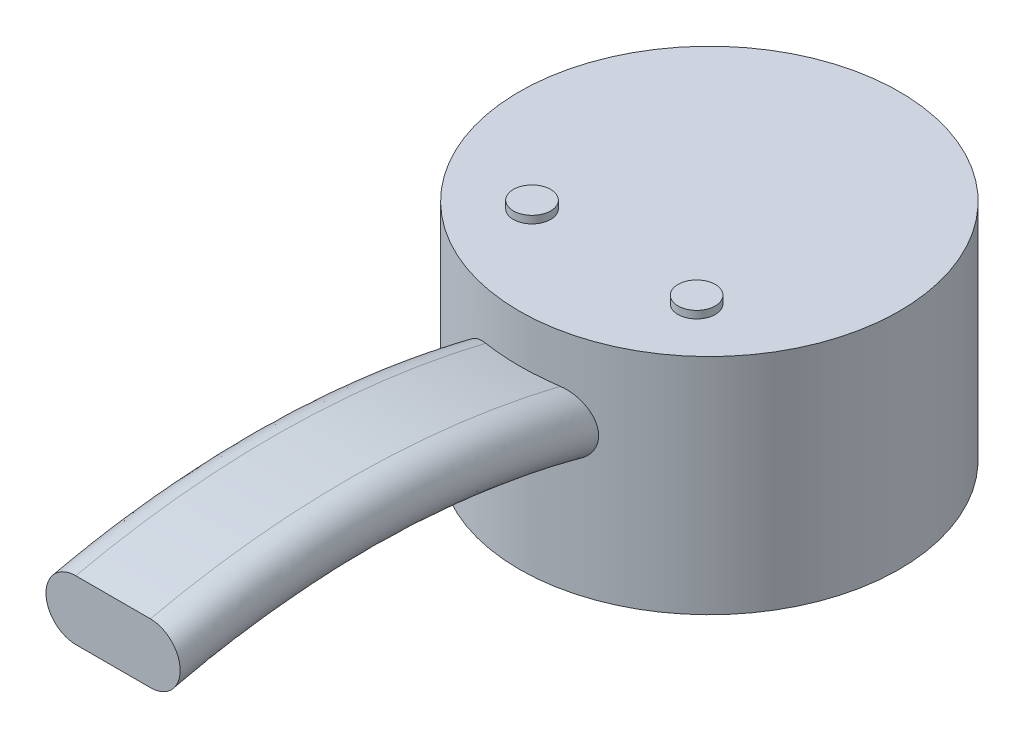
ISO-10303-21;
HEADER;
FILE_DESCRIPTION(('STEP AP214'),'2;1');
FILE_NAME('part.step','',(''),(''),'','','');
FILE_SCHEMA(('AUTOMOTIVE_DESIGN { 1 0 10303 214 1 1 1 1 }'));
ENDSEC;
DATA;
#1=APPLICATION_CONTEXT('core data for automotive mechanical design processes');
#2=APPLICATION_PROTOCOL_DEFINITION('international standard','automotive_design',2000,#1);
#3=PRODUCT_CONTEXT('',#1,'mechanical');
#4=PRODUCT('Part','Part','',(#3));
#5=PRODUCT_RELATED_PRODUCT_CATEGORY('part','',(#4));
#6=PRODUCT_DEFINITION_FORMATION('','',#4);
#7=PRODUCT_DEFINITION_CONTEXT('part definition',#1,'design');
#8=PRODUCT_DEFINITION('design','',#6,#7);
#9=PRODUCT_DEFINITION_SHAPE('','',#8);
#10=(LENGTH_UNIT() NAMED_UNIT(*) SI_UNIT(.MILLI.,.METRE.));
#11=(NAMED_UNIT(*) PLANE_ANGLE_UNIT() SI_UNIT($,.RADIAN.));
#12=(NAMED_UNIT(*) SI_UNIT($,.STERADIAN.) SOLID_ANGLE_UNIT());
#13=UNCERTAINTY_MEASURE_WITH_UNIT(LENGTH_MEASURE(1.E-05),#10,'distance_accuracy_value','');
#14=(GEOMETRIC_REPRESENTATION_CONTEXT(3) GLOBAL_UNCERTAINTY_ASSIGNED_CONTEXT((#13)) GLOBAL_UNIT_ASSIGNED_CONTEXT((#10,
#11,#12)) REPRESENTATION_CONTEXT('',''));
#15=CARTESIAN_POINT('',(0.,0.,0.));
#16=DIRECTION('',(0.,0.,1.));
#17=DIRECTION('',(1.,0.,0.));
#18=AXIS2_PLACEMENT_3D('',#15,#16,#17);
#19=CARTESIAN_POINT('',(0.,30.,0.));
#20=DIRECTION('',(0.,-1.,0.));
#21=DIRECTION('',(0.,0.,-1.));
#22=AXIS2_PLACEMENT_3D('',#19,#20,#21);
#23=CYLINDRICAL_SURFACE('',#22,25.5);
#24=CARTESIAN_POINT('',(5.00000000000001,23.5171234591143,25.0049995001));
#25=CARTESIAN_POINT('',(5.11586119327294,23.5114770083202,24.9818400676881));
#26=CARTESIAN_POINT('',(5.2312836132771,23.5005587174941,24.9579147875684));
#27=CARTESIAN_POINT('',(5.46037433476177,23.4685496245778,24.9087920461385));
#28=CARTESIAN_POINT('',(5.57404352125647,23.4474641405948,24.8835952560734));
#29=CARTESIAN_POINT('',(5.79846972880424,23.3955786294533,24.8322567669333));
#30=CARTESIAN_POINT('',(5.90923575231437,23.3648138093524,24.8061187916789));
#31=CARTESIAN_POINT('',(6.12755297742745,23.2939969636314,24.7530954583561));
#32=CARTESIAN_POINT('',(6.23510380190959,23.253943853346,24.726210013323));
#33=CARTESIAN_POINT('',(6.55155375823598,23.1206894196052,24.6449658670733));
#34=CARTESIAN_POINT('',(6.75485452415625,23.0142502326013,24.5898797439162));
#35=CARTESIAN_POINT('',(7.14184282455997,22.7699829208294,24.4802924908404));
#36=CARTESIAN_POINT('',(7.32551072220129,22.6321237934209,24.4257919947653));
#37=CARTESIAN_POINT('',(7.68124026389445,22.3185948201263,24.3163619404927));
#38=CARTESIAN_POINT('',(7.85167928023143,22.1409996230069,24.2616521894264));
#39=CARTESIAN_POINT('',(8.1619769913878,21.7591169834799,24.1590336054701));
#40=CARTESIAN_POINT('',(8.30182786784529,21.5548227380334,24.1111265124421));
#41=CARTESIAN_POINT('',(8.55029490673224,21.118209986877,24.0241617462246));
#42=CARTESIAN_POINT('',(8.65793723646408,20.885271394577,23.9853863515872));
#43=CARTESIAN_POINT('',(8.78825520716183,20.5235258147427,23.9378083382814));
#44=CARTESIAN_POINT('',(8.82651461052759,20.4008250963177,23.9237089092328));
#45=CARTESIAN_POINT('',(8.89208287767288,20.1521769487625,23.8994162818095));
#46=CARTESIAN_POINT('',(8.91939793592266,20.0262313992857,23.8892208739143));
#47=CARTESIAN_POINT('',(8.96109477502268,19.7805002960236,23.8736096869514));
#48=CARTESIAN_POINT('',(8.97621034380283,19.6608558781217,23.8679231669153));
#49=CARTESIAN_POINT('',(8.99598498935999,19.4206344787343,23.8604771300486));
#50=CARTESIAN_POINT('',(9.00064968806253,19.3000580336702,23.8587155018703));
#51=CARTESIAN_POINT('',(8.99920510913911,19.0590345770044,23.859260432564));
#52=CARTESIAN_POINT('',(8.99310143647839,18.9385875306998,23.8615648750358));
#53=CARTESIAN_POINT('',(8.96991488800981,18.6989056631677,23.870290782688));
#54=CARTESIAN_POINT('',(8.95283329588516,18.579670701863,23.8767117665079));
#55=CARTESIAN_POINT('',(8.91014469835881,18.356736220759,23.8926720043126));
#56=CARTESIAN_POINT('',(8.88569622225414,18.2527829131021,23.9017853732483));
#57=CARTESIAN_POINT('',(8.82813385508486,18.04757553106,23.92310588636));
#58=CARTESIAN_POINT('',(8.79501638596408,17.9463225902879,23.9353143079281));
#59=CARTESIAN_POINT('',(8.72031459655158,17.7474301337763,23.9626311654879));
#60=CARTESIAN_POINT('',(8.67873279585804,17.6497895529344,23.9777387384057));
#61=CARTESIAN_POINT('',(8.58741137172211,17.458924278827,24.010595943986));
#62=CARTESIAN_POINT('',(8.53767577756446,17.3656974336452,24.0283442712929));
#63=CARTESIAN_POINT('',(8.43359433063942,17.1896849881222,24.0650648665652));
#64=CARTESIAN_POINT('',(8.37969322539625,17.1066078564257,24.0839032627538));
#65=CARTESIAN_POINT('',(8.26541913683764,16.9455122435495,24.1233600328423));
#66=CARTESIAN_POINT('',(8.20504764119031,16.8674926061461,24.1439779973737));
#67=CARTESIAN_POINT('',(8.07828800064618,16.7169756771163,24.1866849442757));
#68=CARTESIAN_POINT('',(8.01190167444683,16.6444767283276,24.2087734814588));
#69=CARTESIAN_POINT('',(7.87355747290219,16.5053247833144,24.2541214764869));
#70=CARTESIAN_POINT('',(7.80159538783623,16.438676286793,24.2773818143189));
#71=CARTESIAN_POINT('',(7.5747276033712,16.2451563136957,24.3495168067577));
#72=CARTESIAN_POINT('',(7.41170935037708,16.1281091791383,24.3997646686806));
#73=CARTESIAN_POINT('',(7.06909306986959,15.9220479800501,24.50122061115));
#74=CARTESIAN_POINT('',(6.88948762486398,15.8330465363035,24.5524291130409));
#75=CARTESIAN_POINT('',(6.60489749786124,15.7188472655062,24.6299808651231));
#76=CARTESIAN_POINT('',(6.50409365413252,15.6832341996257,24.6568029861296));
#77=CARTESIAN_POINT('',(6.29980900509476,15.6204044659123,24.709785682138));
#78=CARTESIAN_POINT('',(6.19633050918533,15.5931808006264,24.735946791665));
#79=CARTESIAN_POINT('',(5.98736088284321,15.5471642925692,24.7873574605625));
#80=CARTESIAN_POINT('',(5.8818707634541,15.5283673252017,24.8126074603145));
#81=CARTESIAN_POINT('',(5.66948869749156,15.4991996570407,24.8619946478658));
#82=CARTESIAN_POINT('',(5.56259701230969,15.4888274071291,24.8861320394786));
#83=CARTESIAN_POINT('',(5.37960255934615,15.4783047294108,24.9262088836014));
#84=CARTESIAN_POINT('',(5.30368476183768,15.4760459275743,24.9424726351605));
#85=CARTESIAN_POINT('',(5.15183471420414,15.4757048592893,24.9742791867459));
#86=CARTESIAN_POINT('',(5.07590274803902,15.4776149108436,24.9898232590248));
#87=CARTESIAN_POINT('',(5.,15.4815974424021,25.0049995001));
#88=B_SPLINE_CURVE_WITH_KNOTS('',3,(#24,#25,#26,#27,#28,#29,#30,#31,#32,#33,#34,#35,#36,#37,#38,
#39,#40,#41,#42,#43,#44,#45,#46,#47,#48,#49,#50,#51,#52,#53,#54,#55,#56,#57,#58,#59,#60,#61,#62,
#63,#64,#65,#66,#67,#68,#69,#70,#71,#72,#73,#74,#75,#76,#77,#78,#79,#80,#81,#82,#83,#84,#85,#86,
#87),.UNSPECIFIED.,.F.,.F.,(4,2,2,2,2,2,2,2,2,2,2,2,2,2,2,2,2,2,2,2,2,2,2,2,2,2,2,2,2,2,2,4),
(0.,0.3547019810116,0.709218630607935,1.0624604060178,1.41574345298626,2.12042372064439,
2.82580234306327,3.57883990833118,4.33206972646943,5.10618960831037,5.49362596057393,
5.88084271406502,6.24253735873861,6.60403738716725,6.96534930940218,7.32661898996438,
7.64773653263051,7.96898682350076,8.29014162648954,8.61113820311302,8.91320784878158,
9.21520819117619,9.51711752089114,9.81925705712564,10.4370388899571,11.0550983338245,
11.3854640923617,11.7155535480599,12.0454812587592,12.3753482893526,12.608258880812,
12.8407406474764),.UNSPECIFIED.);
#89=CARTESIAN_POINT('',(5.,23.5171234591143,25.0049995001));
#90=VERTEX_POINT('',#89);
#91=CARTESIAN_POINT('',(5.,15.4815974424021,25.0049995001));
#92=VERTEX_POINT('',#91);
#93=EDGE_CURVE('E263',#90,#92,#88,.T.);
#94=ORIENTED_EDGE('',*,*,#93,.T.);
#95=CARTESIAN_POINT('',(5.,15.4815974424021,25.0049995001));
#96=CARTESIAN_POINT('',(4.6571869189848,15.4995803882547,25.0735484072848));
#97=CARTESIAN_POINT('',(4.31291148382205,15.5156515066156,25.1350565929772));
#98=CARTESIAN_POINT('',(3.62196680378393,15.54400818985,25.2438845090512));
#99=CARTESIAN_POINT('',(3.27529753374851,15.5562937148736,25.2912040900728));
#100=CARTESIAN_POINT('',(2.23225789405615,15.5875359844931,25.4117461583066));
#101=CARTESIAN_POINT('',(1.53310136537391,15.6008656297786,25.4635028415472));
#102=CARTESIAN_POINT('',(0.144696030938419,15.6125591726033,25.5088928790099));
#103=CARTESIAN_POINT('',(-0.54452142306145,15.6111712356133,25.5034900511607));
#104=CARTESIAN_POINT('',(-1.91972717469327,15.5940153593431,25.4369406445132));
#105=CARTESIAN_POINT('',(-2.6057173939908,15.5782574802201,25.3758330636962));
#106=CARTESIAN_POINT('',(-3.57416839090423,15.5455709217045,25.2499286163593));
#107=CARTESIAN_POINT('',(-3.85994467978717,15.5346204942045,25.207821366889));
#108=CARTESIAN_POINT('',(-4.43081799155923,15.5100900437521,25.1137769292275));
#109=CARTESIAN_POINT('',(-4.71590888814118,15.4965007173594,25.0618049780939));
#110=CARTESIAN_POINT('',(-4.99999999999999,15.4815974424021,25.0049995001));
#111=B_SPLINE_CURVE_WITH_KNOTS('',3,(#95,#96,#97,#98,#99,#100,#101,#102,#103,#104,#105,#106,
#107,#108,#109,#110),.UNSPECIFIED.,.F.,.F.,(4,2,2,2,2,2,2,4),(0.,1.0500161844102,
2.10004342170411,4.20084803283539,6.2662863279001,8.33027975315213,9.19734407080484,
10.0675226186394),.UNSPECIFIED.);
#112=CARTESIAN_POINT('',(-4.99999999999999,15.4815974424021,25.0049995001));
#113=VERTEX_POINT('',#112);
#114=EDGE_CURVE('E276',#92,#113,#111,.T.);
#115=ORIENTED_EDGE('',*,*,#114,.T.);
#116=CARTESIAN_POINT('',(-5.,15.4815974424021,25.0049995001));
#117=CARTESIAN_POINT('',(-5.11482978239013,15.4755667568966,24.9820460784526));
#118=CARTESIAN_POINT('',(-5.22974246747253,15.4742888865266,24.95823787164));
#119=CARTESIAN_POINT('',(-5.45896900362491,15.4812732708612,24.9091006081208));
#120=CARTESIAN_POINT('',(-5.57328275911831,15.489537004264,24.8837713162627));
#121=CARTESIAN_POINT('',(-5.80074285198038,15.5156676495377,24.8317347313428));
#122=CARTESIAN_POINT('',(-5.91388632685383,15.5335541481524,24.8050247284866));
#123=CARTESIAN_POINT('',(-6.13796363412349,15.5789289908289,24.7505290724648));
#124=CARTESIAN_POINT('',(-6.24889758841804,15.6064168036306,24.7227434788894));
#125=CARTESIAN_POINT('',(-6.46792789544616,15.6709936484387,24.666347924498));
#126=CARTESIAN_POINT('',(-6.57601945691516,15.7080978739871,24.6377367234077));
#127=CARTESIAN_POINT('',(-6.78834959386935,15.7917808891694,24.5800815934871));
#128=CARTESIAN_POINT('',(-6.89258837752725,15.8383591660159,24.551037688156));
#129=CARTESIAN_POINT('',(-7.09631441948191,15.9407929065271,24.4929282866582));
#130=CARTESIAN_POINT('',(-7.19580467457471,15.996642416714,24.4638628161871));
#131=CARTESIAN_POINT('',(-7.3892042016699,16.1173648578013,24.4061434870948));
#132=CARTESIAN_POINT('',(-7.48311661062217,16.1822326469599,24.377489404121));
#133=CARTESIAN_POINT('',(-7.66061063154283,16.317655247193,24.3222800211074));
#134=CARTESIAN_POINT('',(-7.74446419697446,16.387838504285,24.2956876945929));
#135=CARTESIAN_POINT('',(-7.90558253430665,16.5357514562494,24.2437399628309));
#136=CARTESIAN_POINT('',(-7.98285022271389,16.6134777777758,24.2183840122147));
#137=CARTESIAN_POINT('',(-8.13013462374817,16.7760074525565,24.1693388039873));
#138=CARTESIAN_POINT('',(-8.20015145466266,16.8608106903201,24.1456495191886));
#139=CARTESIAN_POINT('',(-8.33228212470535,17.0368877234655,24.1003724924203));
#140=CARTESIAN_POINT('',(-8.39439649479268,17.1281610834834,24.0787846092822));
#141=CARTESIAN_POINT('',(-8.50593526163346,17.309603250999,24.0395986359107));
#142=CARTESIAN_POINT('',(-8.5559541455297,17.3993692254603,24.0218245351527));
#143=CARTESIAN_POINT('',(-8.6483417418668,17.5832281620523,23.9887180885508));
#144=CARTESIAN_POINT('',(-8.69070790011536,17.6773225557482,23.973386558146));
#145=CARTESIAN_POINT('',(-8.76744755410127,17.869027924518,23.945428203225));
#146=CARTESIAN_POINT('',(-8.801826416409,17.9666364872398,23.9327995631207));
#147=CARTESIAN_POINT('',(-8.86244539302846,18.1647076652455,23.9104183621629));
#148=CARTESIAN_POINT('',(-8.88868250028627,18.2651713201031,23.9006668640106));
#149=CARTESIAN_POINT('',(-8.93213282106418,18.4645894244979,23.8844620120042));
#150=CARTESIAN_POINT('',(-8.94962961795667,18.5634737146311,23.8779052096075));
#151=CARTESIAN_POINT('',(-8.97695486046135,18.7624535612758,23.8676450430625));
#152=CARTESIAN_POINT('',(-8.98678061451421,18.8625495304339,23.8639426804647));
#153=CARTESIAN_POINT('',(-9.00483072308566,19.1635665478612,23.8571435724773));
#154=CARTESIAN_POINT('',(-9.00166395467309,19.3653850096357,23.8583412267305));
#155=CARTESIAN_POINT('',(-8.96553519456566,19.7743424059596,23.8719400607578));
#156=CARTESIAN_POINT('',(-8.93132876989897,19.9813493358601,23.8848091569794));
#157=CARTESIAN_POINT('',(-8.83371143238156,20.3873960133887,23.9210832265717));
#158=CARTESIAN_POINT('',(-8.77028948512826,20.5864327198456,23.944492180663));
#159=CARTESIAN_POINT('',(-8.60919466927908,20.9916421413623,24.0029122558939));
#160=CARTESIAN_POINT('',(-8.50876165042433,21.1965840379453,24.0388396396859));
#161=CARTESIAN_POINT('',(-8.27901585834714,21.5878345545886,24.1189274003429));
#162=CARTESIAN_POINT('',(-8.14969069989044,21.7741351339119,24.1630913066243));
#163=CARTESIAN_POINT('',(-7.8519671421234,22.1407569571345,24.261562971034));
#164=CARTESIAN_POINT('',(-7.68104148520145,22.318878054285,24.3164336549171));
#165=CARTESIAN_POINT('',(-7.31222878653569,22.6437214766366,24.4298671932071));
#166=CARTESIAN_POINT('',(-7.11432345678298,22.7904223288855,24.4884325374252));
#167=CARTESIAN_POINT('',(-6.79847441442305,22.9846142924268,24.577289810063));
#168=CARTESIAN_POINT('',(-6.68859363114987,23.0456015968664,24.6074438585203));
#169=CARTESIAN_POINT('',(-6.46371181727921,23.1573903406761,24.6674672161777));
#170=CARTESIAN_POINT('',(-6.34871307748689,23.2081962823024,24.6973366456477));
#171=CARTESIAN_POINT('',(-6.11457340980803,23.298915169836,24.7563436012019));
#172=CARTESIAN_POINT('',(-5.99544040062084,23.3388477703468,24.7854823602734));
#173=CARTESIAN_POINT('',(-5.75375813258521,23.4073331692949,24.8426984833486));
#174=CARTESIAN_POINT('',(-5.6312110796103,23.4358931413369,24.8707765062909));
#175=CARTESIAN_POINT('',(-5.42372651601799,23.4738065355774,24.9166720486733));
#176=CARTESIAN_POINT('',(-5.33945022976337,23.4863844650782,24.9348698272169));
#177=CARTESIAN_POINT('',(-5.17019503345469,23.5059597360663,24.97051421492));
#178=CARTESIAN_POINT('',(-5.08521701213188,23.5129632875845,24.9879616394334));
#179=CARTESIAN_POINT('',(-5.,23.5171234591143,25.0049995001));
#180=B_SPLINE_CURVE_WITH_KNOTS('',3,(#116,#117,#118,#119,#120,#121,#122,#123,#124,#125,#126,
#127,#128,#129,#130,#131,#132,#133,#134,#135,#136,#137,#138,#139,#140,#141,#142,#143,#144,#145,
#146,#147,#148,#149,#150,#151,#152,#153,#154,#155,#156,#157,#158,#159,#160,#161,#162,#163,#164,
#165,#166,#167,#168,#169,#170,#171,#172,#173,#174,#175,#176,#177,#178,#179),.UNSPECIFIED.,.F.,
.F.,(4,2,2,2,2,2,2,2,2,2,2,2,2,2,2,2,2,2,2,2,2,2,2,2,2,2,2,2,2,2,2,4),(0.,0.351677490029636,
0.703409488153197,1.05586014611265,1.40829130535074,1.76128272253153,2.11425503896759,
2.46700156654436,2.81954779541509,3.15671403576452,3.49373018027121,3.83074082597065,
4.16772881626063,4.48019762946363,4.79277054108827,5.10513282734327,5.4176103437114,
5.71915603573343,6.02080748440714,6.62359858205405,7.25167873085342,7.87999629381093,
8.57025426764755,9.26080870504622,10.0161393523927,10.7719845657007,11.1592831463289,
11.546410081565,11.9328325310697,12.3190108461808,12.5802318841728,12.8411615048661),.UNSPECIFIED.);
#181=CARTESIAN_POINT('',(-5.,23.5171234591143,25.0049995001));
#182=VERTEX_POINT('',#181);
#183=EDGE_CURVE('E184',#113,#182,#180,.T.);
#184=ORIENTED_EDGE('',*,*,#183,.T.);
#185=CARTESIAN_POINT('',(-5.,23.5171234591143,25.0049995001));
#186=CARTESIAN_POINT('',(-4.65572304082796,23.5339402256019,25.0738410285221));
#187=CARTESIAN_POINT('',(-4.30998400049698,23.5489614911826,25.1355792228459));
#188=CARTESIAN_POINT('',(-3.61611485685305,23.5754491520663,25.2447438894993));
#189=CARTESIAN_POINT('',(-3.26798472817909,23.5869155096045,25.2921702097898));
#190=CARTESIAN_POINT('',(-2.22056582391366,23.6160429643787,25.412850907758));
#191=CARTESIAN_POINT('',(-1.51849842999068,23.6284203260694,25.4644570510902));
#192=CARTESIAN_POINT('',(-0.124314818580248,23.6391260033295,25.5090781821828));
#193=CARTESIAN_POINT('',(0.567770898046128,23.6376863779335,25.5030609694221));
#194=CARTESIAN_POINT('',(1.94864954906892,23.6213017464352,25.4348191273974));
#195=CARTESIAN_POINT('',(2.63744445847203,23.6063662482329,25.3726340686335));
#196=CARTESIAN_POINT('',(3.6028645854639,23.5756928406276,25.2457843483056));
#197=CARTESIAN_POINT('',(3.88287642603975,23.5656285040085,25.204233813252));
#198=CARTESIAN_POINT('',(4.44224636576842,23.543147697307,25.1116914107992));
#199=CARTESIAN_POINT('',(4.72159877218756,23.530723140335,25.060667097121));
#200=CARTESIAN_POINT('',(5.,23.5171234591143,25.0049995001));
#201=B_SPLINE_CURVE_WITH_KNOTS('',3,(#185,#186,#187,#188,#189,#190,#191,#192,#193,#194,#195,
#196,#197,#198,#199,#200),.UNSPECIFIED.,.F.,.F.,(4,2,2,2,2,2,2,4),(0.,1.05431490238828,
2.10864100465721,4.21805612599001,6.29210603293653,8.36469590110841,9.21433365938504,
10.0669368501532),.UNSPECIFIED.);
#202=EDGE_CURVE('E264',#182,#90,#201,.T.);
#203=ORIENTED_EDGE('',*,*,#202,.T.);
#204=EDGE_LOOP('',(#94,#115,#184,#203));
#205=FACE_BOUND('',#204,.T.);
#206=CARTESIAN_POINT('',(0.,30.,0.));
#207=DIRECTION('',(0.,1.,0.));
#208=DIRECTION('',(0.,0.,1.));
#209=AXIS2_PLACEMENT_3D('',#206,#207,#208);
#210=CIRCLE('',#209,25.5);
#211=CARTESIAN_POINT('',(0.,30.,25.5));
#212=VERTEX_POINT('',#211);
#213=EDGE_CURVE('E223',#212,#212,#210,.T.);
#214=ORIENTED_EDGE('',*,*,#213,.F.);
#215=EDGE_LOOP('',(#214));
#216=FACE_BOUND('',#215,.T.);
#217=CARTESIAN_POINT('',(0.,0.,0.));
#218=DIRECTION('',(0.,1.,0.));
#219=DIRECTION('',(0.,0.,1.));
#220=AXIS2_PLACEMENT_3D('',#217,#218,#219);
#221=CIRCLE('',#220,25.5);
#222=CARTESIAN_POINT('',(0.,0.,25.5));
#223=VERTEX_POINT('',#222);
#224=EDGE_CURVE('E224',#223,#223,#221,.T.);
#225=ORIENTED_EDGE('',*,*,#224,.T.);
#226=EDGE_LOOP('',(#225));
#227=FACE_BOUND('',#226,.T.);
#228=ADVANCED_FACE('F41',(#205,#216,#227),#23,.T.);
#229=CARTESIAN_POINT('',(0.,30.,0.));
#230=DIRECTION('',(0.,1.,0.));
#231=DIRECTION('',(0.,0.,1.));
#232=AXIS2_PLACEMENT_3D('',#229,#230,#231);
#233=PLANE('',#232);
#234=CARTESIAN_POINT('',(11.0418238982516,30.,12.75));
#235=DIRECTION('',(0.,1.,0.));
#236=DIRECTION('',(0.,0.,-1.));
#237=AXIS2_PLACEMENT_3D('',#234,#235,#236);
#238=CIRCLE('',#237,2.5);
#239=CARTESIAN_POINT('',(11.0418238982516,30.,10.25));
#240=VERTEX_POINT('',#239);
#241=EDGE_CURVE('E446',#240,#240,#238,.T.);
#242=ORIENTED_EDGE('',*,*,#241,.F.);
#243=EDGE_LOOP('',(#242));
#244=FACE_BOUND('',#243,.T.);
#245=CARTESIAN_POINT('',(-11.0418238982516,30.,12.75));
#246=DIRECTION('',(0.,1.,0.));
#247=DIRECTION('',(0.,0.,1.));
#248=AXIS2_PLACEMENT_3D('',#245,#246,#247);
#249=CIRCLE('',#248,2.5);
#250=CARTESIAN_POINT('',(-11.0418238982516,30.,15.25));
#251=VERTEX_POINT('',#250);
#252=EDGE_CURVE('E445',#251,#251,#249,.T.);
#253=ORIENTED_EDGE('',*,*,#252,.F.);
#254=EDGE_LOOP('',(#253));
#255=FACE_BOUND('',#254,.T.);
#256=ORIENTED_EDGE('',*,*,#213,.T.);
#257=EDGE_LOOP('',(#256));
#258=FACE_BOUND('',#257,.T.);
#259=ADVANCED_FACE('F231',(#244,#255,#258),#233,.T.);
#260=CARTESIAN_POINT('',(0.,0.,0.));
#261=DIRECTION('',(0.,1.,0.));
#262=DIRECTION('',(0.,0.,1.));
#263=AXIS2_PLACEMENT_3D('',#260,#261,#262);
#264=PLANE('',#263);
#265=CARTESIAN_POINT('',(0.,0.,0.));
#266=DIRECTION('',(0.,1.,0.));
#267=DIRECTION('',(0.,0.,1.));
#268=AXIS2_PLACEMENT_3D('',#265,#266,#267);
#269=CIRCLE('',#268,15.5);
#270=CARTESIAN_POINT('',(0.,0.,15.5));
#271=VERTEX_POINT('',#270);
#272=EDGE_CURVE('E284',#271,#271,#269,.T.);
#273=ORIENTED_EDGE('',*,*,#272,.T.);
#274=EDGE_LOOP('',(#273));
#275=FACE_BOUND('',#274,.T.);
#276=ORIENTED_EDGE('',*,*,#224,.F.);
#277=EDGE_LOOP('',(#276));
#278=FACE_BOUND('',#277,.T.);
#279=ADVANCED_FACE('F300',(#275,#278),#264,.F.);
#280=CARTESIAN_POINT('',(0.,30.,0.));
#281=DIRECTION('',(0.,-1.,0.));
#282=DIRECTION('',(0.,0.,-1.));
#283=AXIS2_PLACEMENT_3D('',#280,#281,#282);
#284=CYLINDRICAL_SURFACE('',#283,15.5);
#285=CARTESIAN_POINT('',(6.47883892146241,20.,14.0810030264092));
#286=CARTESIAN_POINT('',(6.61042294991903,19.9248054049988,14.0204665616473));
#287=CARTESIAN_POINT('',(6.73785264084351,19.8428124359528,13.9595928081178));
#288=CARTESIAN_POINT('',(6.98392626102063,19.6665585854296,13.8381190381493));
#289=CARTESIAN_POINT('',(7.10257622366949,19.5723062537103,13.7775188611117));
#290=CARTESIAN_POINT('',(7.33105503247819,19.3725289985192,13.6573182787769));
#291=CARTESIAN_POINT('',(7.44086332054105,19.2669790614337,13.5977204447118));
#292=CARTESIAN_POINT('',(7.65100610870883,19.0458362115242,13.4806007208481));
#293=CARTESIAN_POINT('',(7.75133908063651,18.9302416844631,13.4230791668326));
#294=CARTESIAN_POINT('',(8.02682927663425,18.5832080532561,13.2613529258401));
#295=CARTESIAN_POINT('',(8.18960242516061,18.3398005099934,13.1608968471792));
#296=CARTESIAN_POINT('',(8.4045115357546,17.9541285230673,13.0238796908207));
#297=CARTESIAN_POINT('',(8.47127197329928,17.8221466819003,12.9804857147878));
#298=CARTESIAN_POINT('',(8.59440174144473,17.5517971115695,12.8992897995811));
#299=CARTESIAN_POINT('',(8.65077404730939,17.4134312251,12.8614862598655));
#300=CARTESIAN_POINT('',(8.77727179802864,17.0611195122918,12.7756775873737));
#301=CARTESIAN_POINT('',(8.84048484626504,16.843530047684,12.7318256556556));
#302=CARTESIAN_POINT('',(8.91324319658569,16.5103530568809,12.6808890362267));
#303=CARTESIAN_POINT('',(8.93381660304341,16.3981922438354,12.6663855697051));
#304=CARTESIAN_POINT('',(8.96702630868812,16.1721521348043,12.64289776738));
#305=CARTESIAN_POINT('',(8.97966763274397,16.0582739736588,12.6339099375734));
#306=CARTESIAN_POINT('',(8.9948659611427,15.8504004744243,12.6230920160385));
#307=CARTESIAN_POINT('',(8.99883965109074,15.7565588406452,12.6202568787893));
#308=CARTESIAN_POINT('',(9.00072209964352,15.5688143656104,12.6189145969265));
#309=CARTESIAN_POINT('',(8.99863382585735,15.4749115767956,12.6204053345988));
#310=CARTESIAN_POINT('',(8.98809771065486,15.2876615050641,12.6279112158819));
#311=CARTESIAN_POINT('',(8.97965155962274,15.194314081139,12.6339251568975));
#312=CARTESIAN_POINT('',(8.95616843785645,15.0088598532594,12.6505831638025));
#313=CARTESIAN_POINT('',(8.94113140086641,14.9167530617861,12.6612272762375));
#314=CARTESIAN_POINT('',(8.90424016230189,14.7340992036213,12.687198982209));
#315=CARTESIAN_POINT('',(8.88235273472154,14.6435620586763,12.7025493948346));
#316=CARTESIAN_POINT('',(8.83177085838259,14.4653092397431,12.7377694972464));
#317=CARTESIAN_POINT('',(8.80307642695331,14.3775935585726,12.7576391755273));
#318=CARTESIAN_POINT('',(8.73900047797359,14.2057411814021,12.8016162491058));
#319=CARTESIAN_POINT('',(8.70361897723468,14.1216044764051,12.8257236337497));
#320=CARTESIAN_POINT('',(8.62641396078255,13.9575843956127,12.8777772633855));
#321=CARTESIAN_POINT('',(8.58459049557215,13.8777009864796,12.9057234782821));
#322=CARTESIAN_POINT('',(8.49831781624725,13.7287290261284,12.9626792773858));
#323=CARTESIAN_POINT('',(8.45431976818969,13.659283068733,12.9914406899004));
#324=CARTESIAN_POINT('',(8.3614679621473,13.5248277391995,13.0513948509934));
#325=CARTESIAN_POINT('',(8.31261391203694,13.4598186343691,13.0825877458195));
#326=CARTESIAN_POINT('',(8.21042299072351,13.3345022335468,13.1469614594535));
#327=CARTESIAN_POINT('',(8.15708691918682,13.2741941025093,13.1801419233444));
#328=CARTESIAN_POINT('',(8.04628693787034,13.158409719556,13.2480754903265));
#329=CARTESIAN_POINT('',(7.98882073710425,13.102936187736,13.282829462227));
#330=CARTESIAN_POINT('',(7.80162451290694,12.9357656145087,13.3942785376725));
#331=CARTESIAN_POINT('',(7.6650113933452,12.833038669289,13.4731035247066));
#332=CARTESIAN_POINT('',(7.37792383157721,12.650857407433,13.6324328078866));
#333=CARTESIAN_POINT('',(7.227437057908,12.5714240623968,13.7129385478277));
#334=CARTESIAN_POINT('',(6.9813919800212,12.4641163181171,13.8390940373224));
#335=CARTESIAN_POINT('',(6.88930230883623,12.4285976604012,13.8851854260451));
#336=CARTESIAN_POINT('',(6.70218527012837,12.3652236002783,13.9764632227131));
#337=CARTESIAN_POINT('',(6.60716059833632,12.337361385527,14.0216504017672));
#338=CARTESIAN_POINT('',(6.41457744416947,12.2891610997854,14.1107924064444));
#339=CARTESIAN_POINT('',(6.31701719371045,12.2688284385394,14.1547463251354));
#340=CARTESIAN_POINT('',(6.11994213260592,12.2356291151274,14.2410639770946));
#341=CARTESIAN_POINT('',(6.02042711623625,12.2227632431835,14.2834275416095));
#342=CARTESIAN_POINT('',(5.76879384597134,12.1997498021459,14.3874156630399));
#343=CARTESIAN_POINT('',(5.61572761931326,12.1943336274225,14.4478466088732));
#344=CARTESIAN_POINT('',(5.30839770849647,12.2001380037841,14.5635905197961));
#345=CARTESIAN_POINT('',(5.15413774238586,12.2113189809054,14.6189153260605));
#346=CARTESIAN_POINT('',(5.,12.2306765326139,14.6714007511212));
#347=B_SPLINE_CURVE_WITH_KNOTS('',3,(#285,#286,#287,#288,#289,#290,#291,#292,#293,#294,#295,
#296,#297,#298,#299,#300,#301,#302,#303,#304,#305,#306,#307,#308,#309,#310,#311,#312,#313,#314,
#315,#316,#317,#318,#319,#320,#321,#322,#323,#324,#325,#326,#327,#328,#329,#330,#331,#332,#333,
#334,#335,#336,#337,#338,#339,#340,#341,#342,#343,#344,#345,#346),.UNSPECIFIED.,.F.,.F.,(4,2,2,
2,2,2,2,2,2,2,2,2,2,2,2,2,2,2,2,2,2,2,2,2,2,2,2,2,2,2,4),(0.,0.489259312974385,
0.978179224772698,1.46820495020595,1.95830957241128,2.8822533269713,3.34421048487854,
3.80603512733543,4.49544502385418,4.83996924342426,5.18427499054705,5.46591265590108,
5.74741246996419,6.02883746741396,6.31026529399512,6.59307983637882,6.87589365877893,
7.15870677018474,7.44151766454406,7.70252056716586,7.96353918061489,8.22451132252258,
8.48562936012472,9.04799409055656,9.61086358333935,9.93738520128678,10.2636153479304,
10.5900794278763,10.9165780517316,11.4095630782759,11.90137452636),.UNSPECIFIED.);
#348=CARTESIAN_POINT('',(6.47883892148232,20.,14.0810030264326));
#349=VERTEX_POINT('',#348);
#350=CARTESIAN_POINT('',(5.,12.2306765326139,14.6714007511212));
#351=VERTEX_POINT('',#350);
#352=EDGE_CURVE('E257',#349,#351,#347,.T.);
#353=ORIENTED_EDGE('',*,*,#352,.F.);
#354=CARTESIAN_POINT('',(0.,20.,0.));
#355=DIRECTION('',(0.,1.,0.));
#356=DIRECTION('',(0.,0.,1.));
#357=AXIS2_PLACEMENT_3D('',#354,#355,#356);
#358=CIRCLE('',#357,15.5);
#359=CARTESIAN_POINT('',(-6.47883892146241,20.,14.0810030264092));
#360=VERTEX_POINT('',#359);
#361=EDGE_CURVE('E285',#349,#360,#358,.T.);
#362=ORIENTED_EDGE('',*,*,#361,.T.);
#363=CARTESIAN_POINT('',(-5.,12.2306765326139,14.6714007511212));
#364=CARTESIAN_POINT('',(-5.119786560733,12.215636521219,14.6305925262925));
#365=CARTESIAN_POINT('',(-5.23962407524593,12.2055319001254,14.5881003497403));
#366=CARTESIAN_POINT('',(-5.47862088940024,12.1952930283424,14.5000282394479));
#367=CARTESIAN_POINT('',(-5.59778001494197,12.1951612310662,14.4544475486631));
#368=CARTESIAN_POINT('',(-5.83525479679424,12.2050030545142,14.3602312776529));
#369=CARTESIAN_POINT('',(-5.95356177902862,12.2150342566303,14.3115797714378));
#370=CARTESIAN_POINT('',(-6.18780920781948,12.2454021576921,14.2118686624584));
#371=CARTESIAN_POINT('',(-6.30374983435475,12.2657380698274,14.1608092438189));
#372=CARTESIAN_POINT('',(-6.53269577613315,12.3169029861509,14.0566616592933));
#373=CARTESIAN_POINT('',(-6.64569392745385,12.3477554141482,14.0035692015201));
#374=CARTESIAN_POINT('',(-6.86759656605495,12.4200808528211,13.896089936863));
#375=CARTESIAN_POINT('',(-6.97650145143197,12.4615528275959,13.8417032566952));
#376=CARTESIAN_POINT('',(-7.18905648388198,12.5551620950729,13.7325051366146));
#377=CARTESIAN_POINT('',(-7.29271860583953,12.6072735732441,13.6776950280599));
#378=CARTESIAN_POINT('',(-7.49400247223477,12.7222774091511,13.568458457168));
#379=CARTESIAN_POINT('',(-7.5916262101265,12.7851661828422,13.5140318735322));
#380=CARTESIAN_POINT('',(-7.82741147790525,12.9564065820564,13.3793906451039));
#381=CARTESIAN_POINT('',(-7.96118879198541,13.0716913759743,13.3000127187454));
#382=CARTESIAN_POINT('',(-8.14668168303209,13.262427408146,13.186618226449));
#383=CARTESIAN_POINT('',(-8.20599770788344,13.3289945226078,13.1497563132058));
#384=CARTESIAN_POINT('',(-8.31911020002893,13.4678674314851,13.0784881696571));
#385=CARTESIAN_POINT('',(-8.37290933389943,13.5401704232177,13.0440807554461));
#386=CARTESIAN_POINT('',(-8.47480931839076,13.6906356451321,12.9781093224079));
#387=CARTESIAN_POINT('',(-8.52287365427455,13.7688307329127,12.9465638019421));
#388=CARTESIAN_POINT('',(-8.61247973861324,13.9301984068291,12.8871286190435));
#389=CARTESIAN_POINT('',(-8.65402153059616,14.013370959743,12.8592389322138));
#390=CARTESIAN_POINT('',(-8.73020703819113,14.1840181473743,12.8076384989452));
#391=CARTESIAN_POINT('',(-8.76485347400847,14.2714910685539,12.7839261049977));
#392=CARTESIAN_POINT('',(-8.82703317817588,14.4500066782803,12.741071916956));
#393=CARTESIAN_POINT('',(-8.8545669660655,14.5410491055346,12.721929789037));
#394=CARTESIAN_POINT('',(-8.90011667108872,14.7169118256883,12.6900991965546));
#395=CARTESIAN_POINT('',(-8.91879596909415,14.8014811978322,12.6769653514369));
#396=CARTESIAN_POINT('',(-8.9503288391149,14.9722460097886,12.6547218918606));
#397=CARTESIAN_POINT('',(-8.96318047619588,15.0584419797938,12.6456136140201));
#398=CARTESIAN_POINT('',(-8.98317065070543,15.2317954248169,12.6314210464917));
#399=CARTESIAN_POINT('',(-8.99031070629826,15.3189526380835,12.6263356874979));
#400=CARTESIAN_POINT('',(-8.99908632486556,15.4936950846116,12.620081770202));
#401=CARTESIAN_POINT('',(-9.00071969138393,15.5812804747143,12.6189147748207));
#402=CARTESIAN_POINT('',(-8.99761151116786,15.8521017280375,12.6211358481022));
#403=CARTESIAN_POINT('',(-8.98395334000205,16.0352734101105,12.6308949972022));
#404=CARTESIAN_POINT('',(-8.93610642637503,16.3973904247374,12.6647856198242));
#405=CARTESIAN_POINT('',(-8.90190373956689,16.5763328008843,12.6889268549255));
#406=CARTESIAN_POINT('',(-8.79255664649502,17.0205448005688,12.7650879802859));
#407=CARTESIAN_POINT('',(-8.70533270119676,17.2815624605549,12.8250963587074));
#408=CARTESIAN_POINT('',(-8.54802345835078,17.6574939987099,12.9300137594553));
#409=CARTESIAN_POINT('',(-8.49106314639787,17.7803881605772,12.9675419146491));
#410=CARTESIAN_POINT('',(-8.3688365318768,18.020587158726,13.0467576692003));
#411=CARTESIAN_POINT('',(-8.30357125918924,18.1378926855676,13.0884447526796));
#412=CARTESIAN_POINT('',(-8.09356391202038,18.4848637219565,13.2201295296317));
#413=CARTESIAN_POINT('',(-7.9364717036195,18.7051739506502,13.3154761703053));
#414=CARTESIAN_POINT('',(-7.59292162765865,19.1164703484296,13.51431963585));
#415=CARTESIAN_POINT('',(-7.40652890550535,19.3075197571788,13.6177981313813));
#416=CARTESIAN_POINT('',(-7.09363658386423,19.5795282428274,13.7821095000185));
#417=CARTESIAN_POINT('',(-6.97654593113909,19.6721194524067,13.841823352081));
#418=CARTESIAN_POINT('',(-6.73393610281901,19.8453305619811,13.9614621083961));
#419=CARTESIAN_POINT('',(-6.60841688450116,19.9259504012889,14.021387013717));
#420=CARTESIAN_POINT('',(-6.47883892146241,20.,14.0810030264092));
#421=B_SPLINE_CURVE_WITH_KNOTS('',3,(#363,#364,#365,#366,#367,#368,#369,#370,#371,#372,#373,
#374,#375,#376,#377,#378,#379,#380,#381,#382,#383,#384,#385,#386,#387,#388,#389,#390,#391,#392,
#393,#394,#395,#396,#397,#398,#399,#400,#401,#402,#403,#404,#405,#406,#407,#408,#409,#410,#411,
#412,#413,#414,#415,#416,#417,#418,#419,#420),.UNSPECIFIED.,.F.,.F.,(4,2,2,2,2,2,2,2,2,2,2,2,2,
2,2,2,2,2,2,2,2,2,2,2,2,2,2,2,4),(0.,0.382213907472771,0.764521843041228,1.14900803460718,
1.53346487336492,1.91878368344226,2.30406492128507,2.68842223280203,3.07265197149745,
3.65064812201622,3.93980174581862,4.22881494252013,4.51957989791688,4.81034291281817,
5.10099099388071,5.39161783870321,5.65410859105579,5.91668643343501,6.17919445822006,
6.4418071773446,6.99139075941408,7.54134778701002,8.38139507962192,8.80275995763439,
9.22407263390929,10.0814027518124,10.9368530009111,11.4185793906236,11.9003082223071),.UNSPECIFIED.);
#422=CARTESIAN_POINT('',(-4.99999999999999,12.2306765326139,14.6714007511212));
#423=VERTEX_POINT('',#422);
#424=EDGE_CURVE('E71',#423,#360,#421,.T.);
#425=ORIENTED_EDGE('',*,*,#424,.F.);
#426=CARTESIAN_POINT('',(5.,12.2306765326139,14.6714007511212));
#427=CARTESIAN_POINT('',(4.80384020436381,12.2553062878245,14.7382522717723));
#428=CARTESIAN_POINT('',(4.60619436304333,12.2784334266124,14.8012175338438));
#429=CARTESIAN_POINT('',(4.20822928356353,12.3216795409703,14.9192457158836));
#430=CARTESIAN_POINT('',(4.00791000838672,12.3417984748403,14.974308526307));
#431=CARTESIAN_POINT('',(3.40351800196354,12.3976265557228,15.1274155957499));
#432=CARTESIAN_POINT('',(2.99589421331195,12.4288216152961,15.2134183562812));
#433=CARTESIAN_POINT('',(2.1861189075287,12.4783903937021,15.3503981235884));
#434=CARTESIAN_POINT('',(1.7841438777371,12.4971050231302,15.4023058015008));
#435=CARTESIAN_POINT('',(0.976993201609699,12.5231040543142,15.474483572228));
#436=CARTESIAN_POINT('',(0.571817609627959,12.5303886497651,15.4947542011681));
#437=CARTESIAN_POINT('',(-0.265818793931826,12.5336224872519,15.5037471014193));
#438=CARTESIAN_POINT('',(-0.698307941186426,12.5287883382882,15.4902890689728));
#439=CARTESIAN_POINT('',(-1.56034041514972,12.5061196184641,15.4273193058667));
#440=CARTESIAN_POINT('',(-1.98988333111374,12.4882832706673,15.3778026472813));
#441=CARTESIAN_POINT('',(-2.85607099266478,12.4388535231759,15.2410951751008));
#442=CARTESIAN_POINT('',(-3.29251579299238,12.4068461002956,15.1527712054964));
#443=CARTESIAN_POINT('',(-3.93928110845704,12.348519124528,14.9927139373677));
#444=CARTESIAN_POINT('',(-4.1535786791456,12.3273542242245,14.9347573884863));
#445=CARTESIAN_POINT('',(-4.57914890401966,12.2815901206113,14.8098130229136));
#446=CARTESIAN_POINT('',(-4.79042161444788,12.2569909812478,14.7428253743839));
#447=CARTESIAN_POINT('',(-4.99999999999999,12.2306765326139,14.6714007511212));
#448=B_SPLINE_CURVE_WITH_KNOTS('',3,(#426,#427,#428,#429,#430,#431,#432,#433,#434,#435,#436,
#437,#438,#439,#440,#441,#442,#443,#444,#445,#446,#447),.UNSPECIFIED.,.F.,.F.,(4,2,2,2,2,2,2,2,
2,2,4),(0.,0.625992562855185,1.25199380247537,2.50362444510879,3.71948832421657,
4.93533159892239,6.23176909727005,7.52838380556657,8.86567504145669,9.53448673801207,
10.2032859828247),.UNSPECIFIED.);
#449=EDGE_CURVE('E11',#351,#423,#448,.T.);
#450=ORIENTED_EDGE('',*,*,#449,.F.);
#451=EDGE_LOOP('',(#353,#362,#425,#450));
#452=FACE_BOUND('',#451,.T.);
#453=ORIENTED_EDGE('',*,*,#272,.F.);
#454=EDGE_LOOP('',(#453));
#455=FACE_BOUND('',#454,.T.);
#456=ADVANCED_FACE('F190',(#452,#455),#284,.F.);
#457=CARTESIAN_POINT('',(0.,20.,0.));
#458=DIRECTION('',(0.,1.,0.));
#459=DIRECTION('',(0.,0.,1.));
#460=AXIS2_PLACEMENT_3D('',#457,#458,#459);
#461=PLANE('',#460);
#462=ORIENTED_EDGE('',*,*,#361,.F.);
#463=CARTESIAN_POINT('',(7.41983175604039,20.,15.686));
#464=CARTESIAN_POINT('',(7.37813569154029,20.,15.5885911934408));
#465=CARTESIAN_POINT('',(7.33490715525819,20.,15.4918153938696));
#466=CARTESIAN_POINT('',(7.24467765627767,20.,15.2992932412032));
#467=CARTESIAN_POINT('',(7.19765451119304,20.,15.2035573067194));
#468=CARTESIAN_POINT('',(7.09952627913591,20.,15.0138914092497));
#469=CARTESIAN_POINT('',(7.04841148559636,20.,14.9199664385005));
#470=CARTESIAN_POINT('',(6.94042485106581,20.,14.7325836444373));
#471=CARTESIAN_POINT('',(6.88344778535484,20.,14.6391860445804));
#472=CARTESIAN_POINT('',(6.76416527579777,20.,14.4560985898127));
#473=CARTESIAN_POINT('',(6.70187056501535,20.,14.3664017840685));
#474=CARTESIAN_POINT('',(6.57109654464169,20.,14.1917937336132));
#475=CARTESIAN_POINT('',(6.50262756316145,20.,14.1068748693036));
#476=CARTESIAN_POINT('',(6.39303755098671,20.,13.9826088180531));
#477=CARTESIAN_POINT('',(6.35454777050277,20.,13.9409366258977));
#478=CARTESIAN_POINT('',(6.27545412874701,20.,13.8596414270729));
#479=CARTESIAN_POINT('',(6.23485002399658,20.,13.8200186574601));
#480=CARTESIAN_POINT('',(6.10976277413998,20.,13.7048869177251));
#481=CARTESIAN_POINT('',(6.02188276962411,19.9999999999999,13.632972816261));
#482=CARTESIAN_POINT('',(5.83445617078293,19.9999999999999,13.5018411135478));
#483=CARTESIAN_POINT('',(5.73473395478467,20.,13.442864845627));
#484=CARTESIAN_POINT('',(5.57821233306572,20.,13.3699407181794));
#485=CARTESIAN_POINT('',(5.52499167468952,20.,13.3482497623654));
#486=CARTESIAN_POINT('',(5.41652916588743,20.,13.310775270874));
#487=CARTESIAN_POINT('',(5.36128924108829,20.,13.2949862603674));
#488=CARTESIAN_POINT('',(5.25534806539555,20.,13.2713709283114));
#489=CARTESIAN_POINT('',(5.20479745152401,20.,13.262870968618));
#490=CARTESIAN_POINT('',(5.10284354892859,20.,13.2514198150833));
#491=CARTESIAN_POINT('',(5.05143743234978,20.,13.2484939684117));
#492=CARTESIAN_POINT('',(5.,20.,13.2485333745094));
#493=B_SPLINE_CURVE_WITH_KNOTS('',3,(#463,#464,#465,#466,#467,#468,#469,#470,#471,#472,#473,
#474,#475,#476,#477,#478,#479,#480,#481,#482,#483,#484,#485,#486,#487,#488,#489,#490,#491,#492),
.UNSPECIFIED.,.F.,.F.,(4,2,2,2,2,2,2,2,2,2,2,2,2,2,4),(0.,0.317891862114912,0.637799434666964,
0.958489789560458,1.28654212919261,1.61394731741582,1.9408146478995,2.11093043499137,
2.28106585556888,2.6207790153515,2.96637280787611,3.13850510031564,3.31047731884861,
3.46395835100597,3.61813565711341),.UNSPECIFIED.);
#494=CARTESIAN_POINT('',(5.,20.,13.2485333745094));
#495=VERTEX_POINT('',#494);
#496=EDGE_CURVE('E56',#349,#495,#493,.T.);
#497=ORIENTED_EDGE('',*,*,#496,.T.);
#498=DIRECTION('',(1.,0.,0.));
#499=VECTOR('',#498,1.);
#500=CARTESIAN_POINT('',(0.,20.,13.2485333745094));
#501=LINE('',#500,#499);
#502=CARTESIAN_POINT('',(-5.,20.,13.2485333745094));
#503=VERTEX_POINT('',#502);
#504=EDGE_CURVE('E222',#495,#503,#501,.F.);
#505=ORIENTED_EDGE('',*,*,#504,.T.);
#506=CARTESIAN_POINT('',(-5.00000000000007,20.,13.2485333745094));
#507=CARTESIAN_POINT('',(-5.04366350845095,20.,13.2485117619096));
#508=CARTESIAN_POINT('',(-5.08731438089217,20.,13.2506134823178));
#509=CARTESIAN_POINT('',(-5.1741714697905,20.,13.2588952045677));
#510=CARTESIAN_POINT('',(-5.21737819626905,20.,13.2650698301625));
#511=CARTESIAN_POINT('',(-5.30247768562824,20.,13.2812221906963));
#512=CARTESIAN_POINT('',(-5.34438027039805,20.,13.2911485123045));
#513=CARTESIAN_POINT('',(-5.42719111838739,20.,13.314528364258));
#514=CARTESIAN_POINT('',(-5.4680990102761,20.,13.3279831903992));
#515=CARTESIAN_POINT('',(-5.60882789256475,20.,13.3805907792467));
#516=CARTESIAN_POINT('',(-5.70557436295041,20.,13.4281543097091));
#517=CARTESIAN_POINT('',(-5.8904785291281,20.,13.5382075488151));
#518=CARTESIAN_POINT('',(-5.97858736685387,20.,13.6007759593091));
#519=CARTESIAN_POINT('',(-6.13229358638199,20.,13.7251755558812));
#520=CARTESIAN_POINT('',(-6.19920393421213,20.,13.7854169210528));
#521=CARTESIAN_POINT('',(-6.32759980619688,20.,13.911471525538));
#522=CARTESIAN_POINT('',(-6.38908119047629,20.,13.9772889432215));
#523=CARTESIAN_POINT('',(-6.50738955860702,20.,14.113404023444));
#524=CARTESIAN_POINT('',(-6.56419704629056,20.,14.1837184730638));
#525=CARTESIAN_POINT('',(-6.6734637028017,20.,14.3276525469582));
#526=CARTESIAN_POINT('',(-6.72592189857924,20.,14.4012729052019));
#527=CARTESIAN_POINT('',(-6.81947205456082,20.,14.539984516789));
#528=CARTESIAN_POINT('',(-6.86109545692776,20.,14.6047200429061));
#529=CARTESIAN_POINT('',(-6.94181593565945,20.,14.7357638161187));
#530=CARTESIAN_POINT('',(-6.98091244105511,20.,14.8020724140652));
#531=CARTESIAN_POINT('',(-7.05681556301109,20.,14.9360152382429));
#532=CARTESIAN_POINT('',(-7.09362133618675,20.,15.0036499407982));
#533=CARTESIAN_POINT('',(-7.16446714135544,20.,15.1387545592338));
#534=CARTESIAN_POINT('',(-7.19854580737033,20.,15.2062042678744));
#535=CARTESIAN_POINT('',(-7.26483110883276,20.,15.3419767366143));
#536=CARTESIAN_POINT('',(-7.2970385893082,20.0000000000001,15.4102990853545));
#537=CARTESIAN_POINT('',(-7.35970088267307,19.9999999999999,15.5476383226693));
#538=CARTESIAN_POINT('',(-7.39015787980347,19.9999999999996,15.6166542136264));
#539=CARTESIAN_POINT('',(-7.41983175604096,19.999999999999,15.6859999999999));
#540=B_SPLINE_CURVE_WITH_KNOTS('',3,(#506,#507,#508,#509,#510,#511,#512,#513,#514,#515,#516,
#517,#518,#519,#520,#521,#522,#523,#524,#525,#526,#527,#528,#529,#530,#531,#532,#533,#534,#535,
#536,#537,#538,#539),.UNSPECIFIED.,.F.,.F.,(4,2,2,2,2,2,2,2,2,2,2,2,2,2,2,2,4),(0.,
0.130919565694168,0.261666662077845,0.390683399786941,0.51974758367525,0.841189958874006,
1.16435669261342,1.4340706155244,1.70398846494537,1.97498047009287,2.24603294053474,
2.47685842400831,2.70773588299133,2.9386978479171,3.16537637854175,3.39195173237237,
3.61823793853868),.UNSPECIFIED.);
#541=EDGE_CURVE('E214',#503,#360,#540,.T.);
#542=ORIENTED_EDGE('',*,*,#541,.T.);
#543=EDGE_LOOP('',(#462,#497,#505,#542));
#544=FACE_BOUND('',#543,.T.);
#545=ADVANCED_FACE('F226',(#544),#461,.F.);
#546=CARTESIAN_POINT('',(5.,9.99999999999999,0.));
#547=DIRECTION('',(0.,0.650298595203718,0.75967870647799));
#548=DIRECTION('',(1.,0.,0.));
#549=AXIS2_PLACEMENT_3D('',#546,#547,#548);
#550=PLANE('',#549);
#551=CARTESIAN_POINT('',(5.,9.99999999999999,0.));
#552=DIRECTION('',(0.,0.650298595203718,0.75967870647799));
#553=DIRECTION('',(1.,0.,0.));
#554=AXIS2_PLACEMENT_3D('',#551,#552,#553);
#555=CIRCLE('',#554,4.);
#556=CARTESIAN_POINT('',(5.,6.96128517408803,2.60119438081487));
#557=VERTEX_POINT('',#556);
#558=CARTESIAN_POINT('',(5.,13.038714825912,-2.60119438081488));
#559=VERTEX_POINT('',#558);
#560=EDGE_CURVE('E124',#557,#559,#555,.T.);
#561=ORIENTED_EDGE('',*,*,#560,.F.);
#562=DIRECTION('',(1.,0.,0.));
#563=VECTOR('',#562,1.);
#564=CARTESIAN_POINT('',(5.,6.96128517408803,2.60119438081487));
#565=LINE('',#564,#563);
#566=CARTESIAN_POINT('',(-4.99999999999999,6.96128517408803,2.60119438081488));
#567=VERTEX_POINT('',#566);
#568=EDGE_CURVE('E118',#567,#557,#565,.T.);
#569=ORIENTED_EDGE('',*,*,#568,.F.);
#570=CARTESIAN_POINT('',(-5.,9.99999999999999,0.));
#571=DIRECTION('',(0.,0.650298595203718,0.75967870647799));
#572=DIRECTION('',(1.,0.,0.));
#573=AXIS2_PLACEMENT_3D('',#570,#571,#572);
#574=CIRCLE('',#573,4.);
#575=CARTESIAN_POINT('',(-5.,13.038714825912,-2.60119438081487));
#576=VERTEX_POINT('',#575);
#577=EDGE_CURVE('E121',#576,#567,#574,.T.);
#578=ORIENTED_EDGE('',*,*,#577,.F.);
#579=DIRECTION('',(-1.,0.,0.));
#580=VECTOR('',#579,1.);
#581=CARTESIAN_POINT('',(5.,13.038714825912,-2.60119438081488));
#582=LINE('',#581,#580);
#583=EDGE_CURVE('E139',#559,#576,#582,.T.);
#584=ORIENTED_EDGE('',*,*,#583,.F.);
#585=EDGE_LOOP('',(#561,#569,#578,#584));
#586=FACE_BOUND('',#585,.T.);
#587=ADVANCED_FACE('F120',(#586),#550,.F.);
#588=CARTESIAN_POINT('',(-5.,13.038714825912,-2.60119438081487));
#589=CARTESIAN_POINT('',(-5.,26.5695789054333,23.017790769909));
#590=CARTESIAN_POINT('',(-5.,30.3808807326004,51.7387005966141));
#591=CARTESIAN_POINT('',(-5.,24.,80.));
#592=CARTESIAN_POINT('',(-13.,13.038714825912,-2.60119438081487));
#593=CARTESIAN_POINT('',(-13.,26.5695789054333,23.017790769909));
#594=CARTESIAN_POINT('',(-13.,30.3808807326004,51.7387005966141));
#595=CARTESIAN_POINT('',(-13.,24.,80.));
#596=CARTESIAN_POINT('',(-13.,6.96128517408803,2.60119438081487));
#597=CARTESIAN_POINT('',(-13.,19.2380676605824,26.7551616313999));
#598=CARTESIAN_POINT('',(-13.,22.3808807326003,53.6671709981749));
#599=CARTESIAN_POINT('',(-13.,16.,80.));
#600=CARTESIAN_POINT('',(-4.99999999999999,6.96128517408803,2.60119438081487));
#601=CARTESIAN_POINT('',(-4.99999999999999,19.2380676605824,26.7551616313999));
#602=CARTESIAN_POINT('',(-4.99999999999999,22.3808807326003,53.6671709981749));
#603=CARTESIAN_POINT('',(-4.99999999999999,16.,80.));
#604=(BOUNDED_SURFACE() B_SPLINE_SURFACE(3,3,((#588,#589,#590,#591),(#592,#593,#594,#595),(#596,
#597,#598,#599),(#600,#601,#602,#603)),.UNSPECIFIED.,.F.,.F.,
.F.) B_SPLINE_SURFACE_WITH_KNOTS((4,4),(4,4),(0.,1.),(0.,1.),
.UNSPECIFIED.) GEOMETRIC_REPRESENTATION_ITEM() RATIONAL_B_SPLINE_SURFACE(((1.,0.958665015363489,
0.958665015363489,1.),(0.333333333333333,0.319555005121163,0.319555005121163,0.333333333333333),
(0.333333333333333,0.319555005121163,0.319555005121163,0.333333333333333),(1.,0.958665015363489,
0.958665015363489,1.))) REPRESENTATION_ITEM('') SURFACE());
#605=CARTESIAN_POINT('',(-4.99999999999999,-93.2381982342581,53.5297747792823));
#606=DIRECTION('',(1.,0.,0.));
#607=DIRECTION('',(0.,0.891458120529077,-0.453103100124866));
#608=AXIS2_PLACEMENT_3D('',#605,#606,#607);
#609=CIRCLE('',#608,112.399540820693);
#610=EDGE_CURVE('E134',#567,#423,#609,.T.);
#611=CARTESIAN_POINT('',(-5.,-93.2381982342581,53.5297747792823));
#612=DIRECTION('',(1.,0.,0.));
#613=DIRECTION('',(0.,0.884246040545699,-0.467021348312102));
#614=AXIS2_PLACEMENT_3D('',#611,#612,#613);
#615=CIRCLE('',#614,120.189300474088);
#616=EDGE_CURVE('E136',#576,#503,#615,.T.);
#617=ORIENTED_EDGE('',*,*,#610,.T.);
#618=ORIENTED_EDGE('',*,*,#424,.T.);
#619=ORIENTED_EDGE('',*,*,#541,.F.);
#620=ORIENTED_EDGE('',*,*,#616,.F.);
#621=ORIENTED_EDGE('',*,*,#577,.T.);
#622=EDGE_LOOP('',(#617,#618,#619,#620,#621));
#623=FACE_BOUND('',#622,.T.);
#624=ADVANCED_FACE('F133',(#623),#604,.T.);
#625=CARTESIAN_POINT('',(0.,-93.2381982342581,53.5297747792823));
#626=DIRECTION('',(1.,0.,0.));
#627=DIRECTION('',(0.,0.,-1.));
#628=AXIS2_PLACEMENT_3D('',#625,#626,#627);
#629=CYLINDRICAL_SURFACE('',#628,120.189300474089);
#630=ORIENTED_EDGE('',*,*,#504,.F.);
#631=CARTESIAN_POINT('',(5.,-93.2381982342581,53.5297747792823));
#632=DIRECTION('',(1.,0.,0.));
#633=DIRECTION('',(0.,0.884246040545699,-0.467021348312102));
#634=AXIS2_PLACEMENT_3D('',#631,#632,#633);
#635=CIRCLE('',#634,120.189300474089);
#636=EDGE_CURVE('E161',#559,#495,#635,.T.);
#637=ORIENTED_EDGE('',*,*,#636,.F.);
#638=ORIENTED_EDGE('',*,*,#583,.T.);
#639=ORIENTED_EDGE('',*,*,#616,.T.);
#640=EDGE_LOOP('',(#630,#637,#638,#639));
#641=FACE_BOUND('',#640,.T.);
#642=ADVANCED_FACE('F200',(#641),#629,.T.);
#643=CARTESIAN_POINT('',(5.,6.96128517408803,2.60119438081487));
#644=CARTESIAN_POINT('',(5.,19.2380676605824,26.7551616313999));
#645=CARTESIAN_POINT('',(5.,22.3808807326003,53.6671709981749));
#646=CARTESIAN_POINT('',(5.,16.,80.));
#647=CARTESIAN_POINT('',(13.,6.96128517408805,2.60119438081486));
#648=CARTESIAN_POINT('',(13.,19.2380676605824,26.7551616313999));
#649=CARTESIAN_POINT('',(13.,22.3808807326004,53.6671709981749));
#650=CARTESIAN_POINT('',(13.,16.,80.));
#651=CARTESIAN_POINT('',(13.,13.038714825912,-2.60119438081488));
#652=CARTESIAN_POINT('',(13.,26.5695789054333,23.017790769909));
#653=CARTESIAN_POINT('',(13.,30.3808807326004,51.7387005966141));
#654=CARTESIAN_POINT('',(13.,24.,80.));
#655=CARTESIAN_POINT('',(5.,13.038714825912,-2.60119438081488));
#656=CARTESIAN_POINT('',(5.,26.5695789054333,23.017790769909));
#657=CARTESIAN_POINT('',(5.,30.3808807326004,51.7387005966141));
#658=CARTESIAN_POINT('',(5.,24.,80.));
#659=(BOUNDED_SURFACE() B_SPLINE_SURFACE(3,3,((#643,#644,#645,#646),(#647,#648,#649,#650),(#651,
#652,#653,#654),(#655,#656,#657,#658)),.UNSPECIFIED.,.F.,.F.,
.F.) B_SPLINE_SURFACE_WITH_KNOTS((4,4),(4,4),(0.,1.),(0.,1.),
.UNSPECIFIED.) GEOMETRIC_REPRESENTATION_ITEM() RATIONAL_B_SPLINE_SURFACE(((1.,0.958665015363489,
0.958665015363489,1.),(0.333333333333333,0.319555005121163,0.319555005121163,0.333333333333333),
(0.333333333333333,0.319555005121163,0.319555005121163,0.333333333333333),(1.,0.958665015363489,
0.958665015363489,1.))) REPRESENTATION_ITEM('') SURFACE());
#660=CARTESIAN_POINT('',(5.,-93.2381982342581,53.5297747792823));
#661=DIRECTION('',(1.,0.,0.));
#662=DIRECTION('',(0.,0.891458120529077,-0.453103100124866));
#663=AXIS2_PLACEMENT_3D('',#660,#661,#662);
#664=CIRCLE('',#663,112.399540820693);
#665=EDGE_CURVE('E153',#557,#351,#664,.T.);
#666=ORIENTED_EDGE('',*,*,#496,.F.);
#667=ORIENTED_EDGE('',*,*,#352,.T.);
#668=ORIENTED_EDGE('',*,*,#665,.F.);
#669=ORIENTED_EDGE('',*,*,#560,.T.);
#670=ORIENTED_EDGE('',*,*,#636,.T.);
#671=EDGE_LOOP('',(#666,#667,#668,#669,#670));
#672=FACE_BOUND('',#671,.T.);
#673=ADVANCED_FACE('F239',(#672),#659,.T.);
#674=CARTESIAN_POINT('',(0.,-93.2381982342581,53.5297747792823));
#675=DIRECTION('',(1.,0.,0.));
#676=DIRECTION('',(0.,0.,-1.));
#677=AXIS2_PLACEMENT_3D('',#674,#675,#676);
#678=CYLINDRICAL_SURFACE('',#677,112.399540820693);
#679=ORIENTED_EDGE('',*,*,#665,.T.);
#680=ORIENTED_EDGE('',*,*,#449,.T.);
#681=ORIENTED_EDGE('',*,*,#610,.F.);
#682=ORIENTED_EDGE('',*,*,#568,.T.);
#683=EDGE_LOOP('',(#679,#680,#681,#682));
#684=FACE_BOUND('',#683,.T.);
#685=ADVANCED_FACE('F141',(#684),#678,.F.);
#686=ORIENTED_EDGE('',*,*,#114,.F.);
#687=CARTESIAN_POINT('',(5.,16.,80.));
#688=VERTEX_POINT('',#687);
#689=EDGE_CURVE('E149',#92,#688,#664,.T.);
#690=ORIENTED_EDGE('',*,*,#689,.T.);
#691=DIRECTION('',(1.,0.,0.));
#692=VECTOR('',#691,1.);
#693=CARTESIAN_POINT('',(5.,16.,80.));
#694=LINE('',#693,#692);
#695=CARTESIAN_POINT('',(-4.99999999999999,16.,80.));
#696=VERTEX_POINT('',#695);
#697=EDGE_CURVE('E144',#696,#688,#694,.T.);
#698=ORIENTED_EDGE('',*,*,#697,.F.);
#699=EDGE_CURVE('E138',#113,#696,#609,.T.);
#700=ORIENTED_EDGE('',*,*,#699,.F.);
#701=EDGE_LOOP('',(#686,#690,#698,#700));
#702=FACE_BOUND('',#701,.T.);
#703=ADVANCED_FACE('F327',(#702),#678,.F.);
#704=CARTESIAN_POINT('',(5.,24.,80.));
#705=VERTEX_POINT('',#704);
#706=EDGE_CURVE('E160',#90,#705,#635,.T.);
#707=CARTESIAN_POINT('',(5.,20.,80.));
#708=DIRECTION('',(0.,0.,1.));
#709=DIRECTION('',(1.,0.,0.));
#710=AXIS2_PLACEMENT_3D('',#707,#708,#709);
#711=CIRCLE('',#710,4.);
#712=EDGE_CURVE('E156',#688,#705,#711,.T.);
#713=ORIENTED_EDGE('',*,*,#93,.F.);
#714=ORIENTED_EDGE('',*,*,#706,.T.);
#715=ORIENTED_EDGE('',*,*,#712,.F.);
#716=ORIENTED_EDGE('',*,*,#689,.F.);
#717=EDGE_LOOP('',(#713,#714,#715,#716));
#718=FACE_BOUND('',#717,.T.);
#719=ADVANCED_FACE('F245',(#718),#659,.T.);
#720=ORIENTED_EDGE('',*,*,#202,.F.);
#721=CARTESIAN_POINT('',(-5.,24.,80.));
#722=VERTEX_POINT('',#721);
#723=EDGE_CURVE('E63',#182,#722,#615,.T.);
#724=ORIENTED_EDGE('',*,*,#723,.T.);
#725=DIRECTION('',(-1.,0.,0.));
#726=VECTOR('',#725,1.);
#727=CARTESIAN_POINT('',(5.,24.,80.));
#728=LINE('',#727,#726);
#729=EDGE_CURVE('E165',#705,#722,#728,.T.);
#730=ORIENTED_EDGE('',*,*,#729,.F.);
#731=ORIENTED_EDGE('',*,*,#706,.F.);
#732=EDGE_LOOP('',(#720,#724,#730,#731));
#733=FACE_BOUND('',#732,.T.);
#734=ADVANCED_FACE('F202',(#733),#629,.T.);
#735=CARTESIAN_POINT('',(-5.,20.,80.));
#736=DIRECTION('',(0.,0.,1.));
#737=DIRECTION('',(1.,0.,0.));
#738=AXIS2_PLACEMENT_3D('',#735,#736,#737);
#739=CIRCLE('',#738,4.);
#740=EDGE_CURVE('E172',#722,#696,#739,.T.);
#741=ORIENTED_EDGE('',*,*,#183,.F.);
#742=ORIENTED_EDGE('',*,*,#699,.T.);
#743=ORIENTED_EDGE('',*,*,#740,.F.);
#744=ORIENTED_EDGE('',*,*,#723,.F.);
#745=EDGE_LOOP('',(#741,#742,#743,#744));
#746=FACE_BOUND('',#745,.T.);
#747=ADVANCED_FACE('F201',(#746),#604,.T.);
#748=CARTESIAN_POINT('',(5.,20.,80.));
#749=DIRECTION('',(0.,0.,1.));
#750=DIRECTION('',(1.,0.,0.));
#751=AXIS2_PLACEMENT_3D('',#748,#749,#750);
#752=PLANE('',#751);
#753=ORIENTED_EDGE('',*,*,#712,.T.);
#754=ORIENTED_EDGE('',*,*,#729,.T.);
#755=ORIENTED_EDGE('',*,*,#740,.T.);
#756=ORIENTED_EDGE('',*,*,#697,.T.);
#757=EDGE_LOOP('',(#753,#754,#755,#756));
#758=FACE_BOUND('',#757,.T.);
#759=ADVANCED_FACE('F205',(#758),#752,.T.);
#760=CARTESIAN_POINT('',(-11.0418238982516,31.,12.75));
#761=DIRECTION('',(0.,-1.,0.));
#762=DIRECTION('',(0.,0.,-1.));
#763=AXIS2_PLACEMENT_3D('',#760,#761,#762);
#764=CYLINDRICAL_SURFACE('',#763,2.5);
#765=CARTESIAN_POINT('',(-11.0418238982516,31.,12.75));
#766=DIRECTION('',(0.,1.,0.));
#767=DIRECTION('',(0.,0.,1.));
#768=AXIS2_PLACEMENT_3D('',#765,#766,#767);
#769=CIRCLE('',#768,2.5);
#770=CARTESIAN_POINT('',(-11.0418238982516,31.,15.25));
#771=VERTEX_POINT('',#770);
#772=EDGE_CURVE('E130',#771,#771,#769,.T.);
#773=ORIENTED_EDGE('',*,*,#772,.F.);
#774=EDGE_LOOP('',(#773));
#775=FACE_BOUND('',#774,.T.);
#776=ORIENTED_EDGE('',*,*,#252,.T.);
#777=EDGE_LOOP('',(#776));
#778=FACE_BOUND('',#777,.T.);
#779=ADVANCED_FACE('F338',(#775,#778),#764,.T.);
#780=CARTESIAN_POINT('',(-11.0418238982516,31.,12.75));
#781=DIRECTION('',(0.,1.,0.));
#782=DIRECTION('',(0.,0.,1.));
#783=AXIS2_PLACEMENT_3D('',#780,#781,#782);
#784=PLANE('',#783);
#785=ORIENTED_EDGE('',*,*,#772,.T.);
#786=EDGE_LOOP('',(#785));
#787=FACE_BOUND('',#786,.T.);
#788=ADVANCED_FACE('F405',(#787),#784,.T.);
#789=CARTESIAN_POINT('',(11.0418238982516,31.,12.75));
#790=DIRECTION('',(0.,-1.,0.));
#791=DIRECTION('',(0.,0.,-1.));
#792=AXIS2_PLACEMENT_3D('',#789,#790,#791);
#793=CYLINDRICAL_SURFACE('',#792,2.5);
#794=CARTESIAN_POINT('',(11.0418238982516,31.,12.75));
#795=DIRECTION('',(0.,1.,0.));
#796=DIRECTION('',(0.,0.,-1.));
#797=AXIS2_PLACEMENT_3D('',#794,#795,#796);
#798=CIRCLE('',#797,2.5);
#799=CARTESIAN_POINT('',(11.0418238982516,31.,10.25));
#800=VERTEX_POINT('',#799);
#801=EDGE_CURVE('E443',#800,#800,#798,.T.);
#802=ORIENTED_EDGE('',*,*,#801,.F.);
#803=EDGE_LOOP('',(#802));
#804=FACE_BOUND('',#803,.T.);
#805=ORIENTED_EDGE('',*,*,#241,.T.);
#806=EDGE_LOOP('',(#805));
#807=FACE_BOUND('',#806,.T.);
#808=ADVANCED_FACE('F415',(#804,#807),#793,.T.);
#809=CARTESIAN_POINT('',(11.0418238982516,31.,12.75));
#810=DIRECTION('',(0.,-1.,0.));
#811=DIRECTION('',(0.,0.,-1.));
#812=AXIS2_PLACEMENT_3D('',#809,#810,#811);
#813=PLANE('',#812);
#814=ORIENTED_EDGE('',*,*,#801,.T.);
#815=EDGE_LOOP('',(#814));
#816=FACE_BOUND('',#815,.T.);
#817=ADVANCED_FACE('F426',(#816),#813,.F.);
#818=CLOSED_SHELL('',(#228,#259,#279,#456,#545,#587,#624,#642,#673,#685,#703,#719,#734,#747,
#759,#779,#788,#808,#817));
#819=MANIFOLD_SOLID_BREP('B2',#818);
#820=ADVANCED_BREP_SHAPE_REPRESENTATION('',(#18,#819),#14);
#821=SHAPE_DEFINITION_REPRESENTATION(#9,#820);
ENDSEC;
END-ISO-10303-21;
